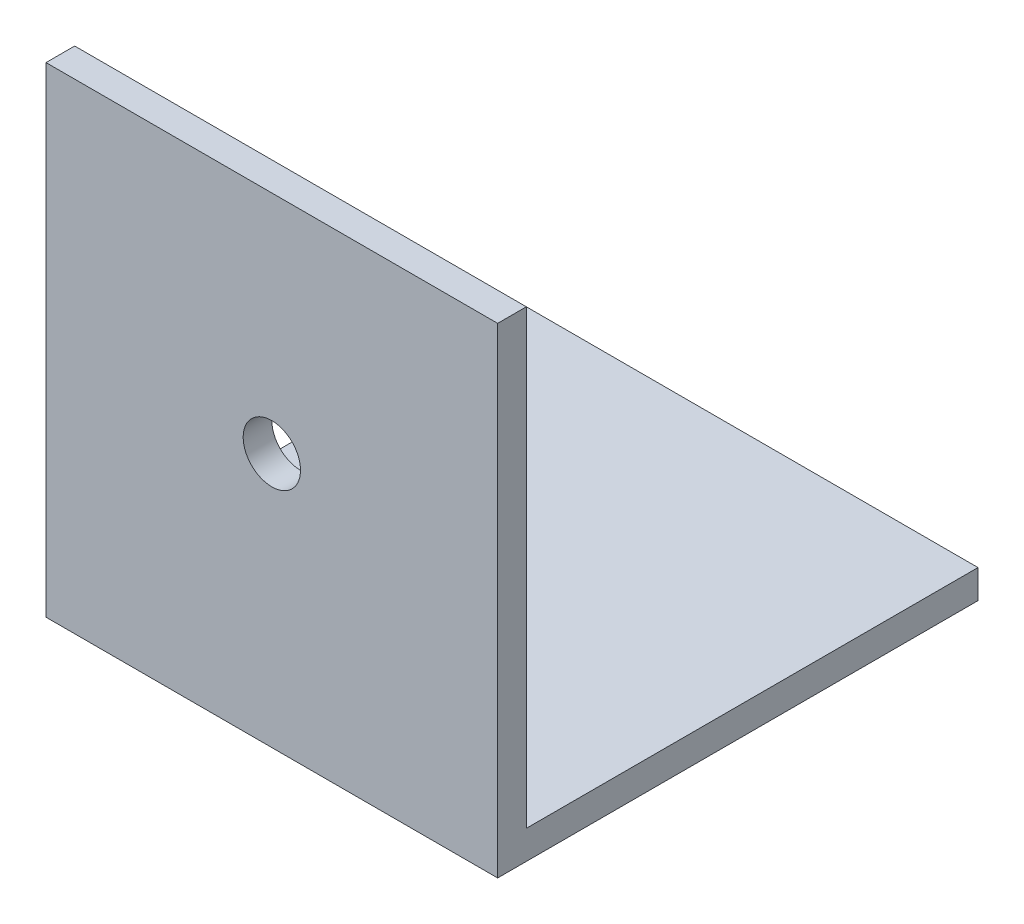
ISO-10303-21;
HEADER;
FILE_DESCRIPTION(('STEP AP214'),'2;1');
FILE_NAME('part.step','',(''),(''),'','','');
FILE_SCHEMA(('AUTOMOTIVE_DESIGN { 1 0 10303 214 1 1 1 1 }'));
ENDSEC;
DATA;
#1=APPLICATION_CONTEXT('core data for automotive mechanical design processes');
#2=APPLICATION_PROTOCOL_DEFINITION('international standard','automotive_design',2000,#1);
#3=PRODUCT_CONTEXT('',#1,'mechanical');
#4=PRODUCT('Part','Part','',(#3));
#5=PRODUCT_RELATED_PRODUCT_CATEGORY('part','',(#4));
#6=PRODUCT_DEFINITION_FORMATION('','',#4);
#7=PRODUCT_DEFINITION_CONTEXT('part definition',#1,'design');
#8=PRODUCT_DEFINITION('design','',#6,#7);
#9=PRODUCT_DEFINITION_SHAPE('','',#8);
#10=(LENGTH_UNIT() NAMED_UNIT(*) SI_UNIT(.MILLI.,.METRE.));
#11=(NAMED_UNIT(*) PLANE_ANGLE_UNIT() SI_UNIT($,.RADIAN.));
#12=(NAMED_UNIT(*) SI_UNIT($,.STERADIAN.) SOLID_ANGLE_UNIT());
#13=UNCERTAINTY_MEASURE_WITH_UNIT(LENGTH_MEASURE(1.E-05),#10,'distance_accuracy_value','');
#14=(GEOMETRIC_REPRESENTATION_CONTEXT(3) GLOBAL_UNCERTAINTY_ASSIGNED_CONTEXT((#13)) GLOBAL_UNIT_ASSIGNED_CONTEXT((#10,
#11,#12)) REPRESENTATION_CONTEXT('',''));
#15=CARTESIAN_POINT('',(0.,0.,0.));
#16=DIRECTION('',(0.,0.,1.));
#17=DIRECTION('',(1.,0.,0.));
#18=AXIS2_PLACEMENT_3D('',#15,#16,#17);
#19=CARTESIAN_POINT('',(-50.,0.,-100.));
#20=DIRECTION('',(0.,1.,0.));
#21=DIRECTION('',(0.,0.,1.));
#22=AXIS2_PLACEMENT_3D('',#19,#20,#21);
#23=PLANE('',#22);
#24=DIRECTION('',(1.,0.,0.));
#25=VECTOR('',#24,1.);
#26=CARTESIAN_POINT('',(-50.,0.,0.));
#27=LINE('',#26,#25);
#28=CARTESIAN_POINT('',(-50.,0.,0.));
#29=VERTEX_POINT('',#28);
#30=CARTESIAN_POINT('',(50.,0.,0.));
#31=VERTEX_POINT('',#30);
#32=EDGE_CURVE('E83',#29,#31,#27,.T.);
#33=ORIENTED_EDGE('',*,*,#32,.T.);
#34=DIRECTION('',(0.,0.,1.));
#35=VECTOR('',#34,1.);
#36=CARTESIAN_POINT('',(50.,0.,-100.));
#37=LINE('',#36,#35);
#38=CARTESIAN_POINT('',(50.,0.,-100.));
#39=VERTEX_POINT('',#38);
#40=EDGE_CURVE('E86',#39,#31,#37,.T.);
#41=ORIENTED_EDGE('',*,*,#40,.F.);
#42=DIRECTION('',(1.,0.,0.));
#43=VECTOR('',#42,1.);
#44=CARTESIAN_POINT('',(-50.,0.,-100.));
#45=LINE('',#44,#43);
#46=CARTESIAN_POINT('',(-50.,0.,-100.));
#47=VERTEX_POINT('',#46);
#48=EDGE_CURVE('E11',#47,#39,#45,.T.);
#49=ORIENTED_EDGE('',*,*,#48,.F.);
#50=DIRECTION('',(0.,0.,1.));
#51=VECTOR('',#50,1.);
#52=CARTESIAN_POINT('',(-50.,0.,-100.));
#53=LINE('',#52,#51);
#54=EDGE_CURVE('E87',#47,#29,#53,.T.);
#55=ORIENTED_EDGE('',*,*,#54,.T.);
#56=EDGE_LOOP('',(#33,#41,#49,#55));
#57=FACE_BOUND('',#56,.T.);
#58=ADVANCED_FACE('F33',(#57),#23,.T.);
#59=CARTESIAN_POINT('',(-50.,-6.35,-100.));
#60=DIRECTION('',(0.,0.,-1.));
#61=DIRECTION('',(-1.,0.,0.));
#62=AXIS2_PLACEMENT_3D('',#59,#60,#61);
#63=PLANE('',#62);
#64=ORIENTED_EDGE('',*,*,#48,.T.);
#65=DIRECTION('',(0.,1.,0.));
#66=VECTOR('',#65,1.);
#67=CARTESIAN_POINT('',(50.,-6.35,-100.));
#68=LINE('',#67,#66);
#69=CARTESIAN_POINT('',(50.,-6.35,-100.));
#70=VERTEX_POINT('',#69);
#71=EDGE_CURVE('E104',#70,#39,#68,.T.);
#72=ORIENTED_EDGE('',*,*,#71,.F.);
#73=DIRECTION('',(1.,0.,0.));
#74=VECTOR('',#73,1.);
#75=CARTESIAN_POINT('',(-50.,-6.35,-100.));
#76=LINE('',#75,#74);
#77=CARTESIAN_POINT('',(-50.,-6.35,-100.));
#78=VERTEX_POINT('',#77);
#79=EDGE_CURVE('E41',#78,#70,#76,.T.);
#80=ORIENTED_EDGE('',*,*,#79,.F.);
#81=DIRECTION('',(0.,1.,0.));
#82=VECTOR('',#81,1.);
#83=CARTESIAN_POINT('',(-50.,-6.35,-100.));
#84=LINE('',#83,#82);
#85=EDGE_CURVE('E92',#78,#47,#84,.T.);
#86=ORIENTED_EDGE('',*,*,#85,.T.);
#87=EDGE_LOOP('',(#64,#72,#80,#86));
#88=FACE_BOUND('',#87,.T.);
#89=ADVANCED_FACE('F148',(#88),#63,.T.);
#90=CARTESIAN_POINT('',(-50.,-6.35,6.35));
#91=DIRECTION('',(0.,-1.,0.));
#92=DIRECTION('',(0.,0.,-1.));
#93=AXIS2_PLACEMENT_3D('',#90,#91,#92);
#94=PLANE('',#93);
#95=ORIENTED_EDGE('',*,*,#79,.T.);
#96=DIRECTION('',(0.,0.,-1.));
#97=VECTOR('',#96,1.);
#98=CARTESIAN_POINT('',(50.,-6.35,6.35));
#99=LINE('',#98,#97);
#100=CARTESIAN_POINT('',(50.,-6.35,6.35));
#101=VERTEX_POINT('',#100);
#102=EDGE_CURVE('E114',#101,#70,#99,.T.);
#103=ORIENTED_EDGE('',*,*,#102,.F.);
#104=DIRECTION('',(1.,0.,0.));
#105=VECTOR('',#104,1.);
#106=CARTESIAN_POINT('',(-50.,-6.35,6.35));
#107=LINE('',#106,#105);
#108=CARTESIAN_POINT('',(-50.,-6.35,6.35));
#109=VERTEX_POINT('',#108);
#110=EDGE_CURVE('E130',#109,#101,#107,.T.);
#111=ORIENTED_EDGE('',*,*,#110,.F.);
#112=DIRECTION('',(0.,0.,-1.));
#113=VECTOR('',#112,1.);
#114=CARTESIAN_POINT('',(-50.,-6.35,6.35));
#115=LINE('',#114,#113);
#116=EDGE_CURVE('E126',#109,#78,#115,.T.);
#117=ORIENTED_EDGE('',*,*,#116,.T.);
#118=EDGE_LOOP('',(#95,#103,#111,#117));
#119=FACE_BOUND('',#118,.T.);
#120=ADVANCED_FACE('F144',(#119),#94,.T.);
#121=CARTESIAN_POINT('',(-50.,100.,6.35));
#122=DIRECTION('',(0.,0.,1.));
#123=DIRECTION('',(0.,-1.,0.));
#124=AXIS2_PLACEMENT_3D('',#121,#122,#123);
#125=PLANE('',#124);
#126=CARTESIAN_POINT('',(0.,50.,6.35));
#127=DIRECTION('',(0.,0.,1.));
#128=DIRECTION('',(0.,-1.,0.));
#129=AXIS2_PLACEMENT_3D('',#126,#127,#128);
#130=CIRCLE('',#129,6.35);
#131=CARTESIAN_POINT('',(0.,43.65,6.35));
#132=VERTEX_POINT('',#131);
#133=EDGE_CURVE('E105',#132,#132,#130,.F.);
#134=ORIENTED_EDGE('',*,*,#133,.T.);
#135=EDGE_LOOP('',(#134));
#136=FACE_BOUND('',#135,.T.);
#137=ORIENTED_EDGE('',*,*,#110,.T.);
#138=DIRECTION('',(0.,-1.,0.));
#139=VECTOR('',#138,1.);
#140=CARTESIAN_POINT('',(50.,100.,6.35));
#141=LINE('',#140,#139);
#142=CARTESIAN_POINT('',(50.,100.,6.35));
#143=VERTEX_POINT('',#142);
#144=EDGE_CURVE('E111',#143,#101,#141,.T.);
#145=ORIENTED_EDGE('',*,*,#144,.F.);
#146=DIRECTION('',(1.,0.,0.));
#147=VECTOR('',#146,1.);
#148=CARTESIAN_POINT('',(-50.,100.,6.35));
#149=LINE('',#148,#147);
#150=CARTESIAN_POINT('',(-50.,100.,6.35));
#151=VERTEX_POINT('',#150);
#152=EDGE_CURVE('E132',#151,#143,#149,.T.);
#153=ORIENTED_EDGE('',*,*,#152,.F.);
#154=DIRECTION('',(0.,-1.,0.));
#155=VECTOR('',#154,1.);
#156=CARTESIAN_POINT('',(-50.,100.,6.35));
#157=LINE('',#156,#155);
#158=EDGE_CURVE('E123',#151,#109,#157,.T.);
#159=ORIENTED_EDGE('',*,*,#158,.T.);
#160=EDGE_LOOP('',(#137,#145,#153,#159));
#161=FACE_BOUND('',#160,.T.);
#162=ADVANCED_FACE('F141',(#136,#161),#125,.T.);
#163=CARTESIAN_POINT('',(-50.,100.,0.));
#164=DIRECTION('',(0.,1.,0.));
#165=DIRECTION('',(0.,0.,1.));
#166=AXIS2_PLACEMENT_3D('',#163,#164,#165);
#167=PLANE('',#166);
#168=ORIENTED_EDGE('',*,*,#152,.T.);
#169=DIRECTION('',(0.,0.,1.));
#170=VECTOR('',#169,1.);
#171=CARTESIAN_POINT('',(50.,100.,0.));
#172=LINE('',#171,#170);
#173=CARTESIAN_POINT('',(50.,100.,0.));
#174=VERTEX_POINT('',#173);
#175=EDGE_CURVE('E99',#174,#143,#172,.T.);
#176=ORIENTED_EDGE('',*,*,#175,.F.);
#177=DIRECTION('',(1.,0.,0.));
#178=VECTOR('',#177,1.);
#179=CARTESIAN_POINT('',(-50.,100.,0.));
#180=LINE('',#179,#178);
#181=CARTESIAN_POINT('',(-50.,100.,0.));
#182=VERTEX_POINT('',#181);
#183=EDGE_CURVE('E91',#182,#174,#180,.T.);
#184=ORIENTED_EDGE('',*,*,#183,.F.);
#185=DIRECTION('',(0.,0.,1.));
#186=VECTOR('',#185,1.);
#187=CARTESIAN_POINT('',(-50.,100.,0.));
#188=LINE('',#187,#186);
#189=EDGE_CURVE('E120',#182,#151,#188,.T.);
#190=ORIENTED_EDGE('',*,*,#189,.T.);
#191=EDGE_LOOP('',(#168,#176,#184,#190));
#192=FACE_BOUND('',#191,.T.);
#193=ADVANCED_FACE('F135',(#192),#167,.T.);
#194=CARTESIAN_POINT('',(-50.,0.,0.));
#195=DIRECTION('',(0.,0.,-1.));
#196=DIRECTION('',(-1.,0.,0.));
#197=AXIS2_PLACEMENT_3D('',#194,#195,#196);
#198=PLANE('',#197);
#199=CARTESIAN_POINT('',(0.,50.,0.));
#200=DIRECTION('',(0.,0.,-1.));
#201=DIRECTION('',(-1.,0.,0.));
#202=AXIS2_PLACEMENT_3D('',#199,#200,#201);
#203=CIRCLE('',#202,6.35);
#204=CARTESIAN_POINT('',(-6.35,50.,0.));
#205=VERTEX_POINT('',#204);
#206=EDGE_CURVE('E36',#205,#205,#203,.F.);
#207=ORIENTED_EDGE('',*,*,#206,.T.);
#208=EDGE_LOOP('',(#207));
#209=FACE_BOUND('',#208,.T.);
#210=ORIENTED_EDGE('',*,*,#183,.T.);
#211=DIRECTION('',(0.,1.,0.));
#212=VECTOR('',#211,1.);
#213=CARTESIAN_POINT('',(50.,0.,0.));
#214=LINE('',#213,#212);
#215=EDGE_CURVE('E94',#31,#174,#214,.T.);
#216=ORIENTED_EDGE('',*,*,#215,.F.);
#217=ORIENTED_EDGE('',*,*,#32,.F.);
#218=DIRECTION('',(0.,1.,0.));
#219=VECTOR('',#218,1.);
#220=CARTESIAN_POINT('',(-50.,0.,0.));
#221=LINE('',#220,#219);
#222=EDGE_CURVE('E118',#29,#182,#221,.T.);
#223=ORIENTED_EDGE('',*,*,#222,.T.);
#224=EDGE_LOOP('',(#210,#216,#217,#223));
#225=FACE_BOUND('',#224,.T.);
#226=ADVANCED_FACE('F95',(#209,#225),#198,.T.);
#227=CARTESIAN_POINT('',(-50.,0.,0.));
#228=DIRECTION('',(-1.,0.,0.));
#229=DIRECTION('',(0.,0.,1.));
#230=AXIS2_PLACEMENT_3D('',#227,#228,#229);
#231=PLANE('',#230);
#232=ORIENTED_EDGE('',*,*,#54,.F.);
#233=ORIENTED_EDGE('',*,*,#85,.F.);
#234=ORIENTED_EDGE('',*,*,#116,.F.);
#235=ORIENTED_EDGE('',*,*,#158,.F.);
#236=ORIENTED_EDGE('',*,*,#189,.F.);
#237=ORIENTED_EDGE('',*,*,#222,.F.);
#238=EDGE_LOOP('',(#232,#233,#234,#235,#236,#237));
#239=FACE_BOUND('',#238,.T.);
#240=ADVANCED_FACE('F147',(#239),#231,.T.);
#241=CARTESIAN_POINT('',(50.,0.,0.));
#242=DIRECTION('',(-1.,0.,0.));
#243=DIRECTION('',(0.,0.,1.));
#244=AXIS2_PLACEMENT_3D('',#241,#242,#243);
#245=PLANE('',#244);
#246=ORIENTED_EDGE('',*,*,#40,.T.);
#247=ORIENTED_EDGE('',*,*,#215,.T.);
#248=ORIENTED_EDGE('',*,*,#175,.T.);
#249=ORIENTED_EDGE('',*,*,#144,.T.);
#250=ORIENTED_EDGE('',*,*,#102,.T.);
#251=ORIENTED_EDGE('',*,*,#71,.T.);
#252=EDGE_LOOP('',(#246,#247,#248,#249,#250,#251));
#253=FACE_BOUND('',#252,.T.);
#254=ADVANCED_FACE('F102',(#253),#245,.F.);
#255=CARTESIAN_POINT('',(0.,50.,50.));
#256=DIRECTION('',(0.,0.,-1.));
#257=DIRECTION('',(-1.,0.,0.));
#258=AXIS2_PLACEMENT_3D('',#255,#256,#257);
#259=CYLINDRICAL_SURFACE('',#258,6.35);
#260=ORIENTED_EDGE('',*,*,#133,.F.);
#261=EDGE_LOOP('',(#260));
#262=FACE_BOUND('',#261,.T.);
#263=ORIENTED_EDGE('',*,*,#206,.F.);
#264=EDGE_LOOP('',(#263));
#265=FACE_BOUND('',#264,.T.);
#266=ADVANCED_FACE('F171',(#262,#265),#259,.F.);
#267=CLOSED_SHELL('',(#58,#89,#120,#162,#193,#226,#240,#254,#266));
#268=MANIFOLD_SOLID_BREP('B2',#267);
#269=ADVANCED_BREP_SHAPE_REPRESENTATION('',(#18,#268),#14);
#270=SHAPE_DEFINITION_REPRESENTATION(#9,#269);
ENDSEC;
END-ISO-10303-21;
